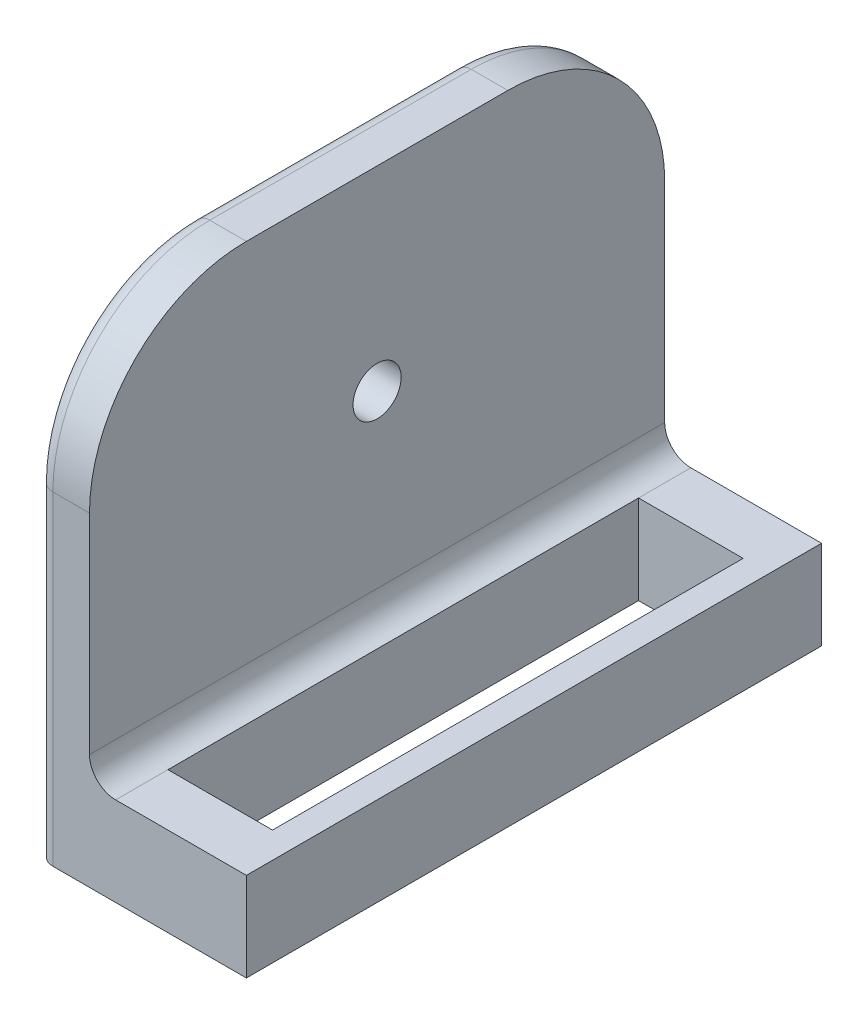
ISO-10303-21;
HEADER;
FILE_DESCRIPTION(('STEP AP214'),'2;1');
FILE_NAME('part.step','',(''),(''),'','','');
FILE_SCHEMA(('AUTOMOTIVE_DESIGN { 1 0 10303 214 1 1 1 1 }'));
ENDSEC;
DATA;
#1=APPLICATION_CONTEXT('core data for automotive mechanical design processes');
#2=APPLICATION_PROTOCOL_DEFINITION('international standard','automotive_design',2000,#1);
#3=PRODUCT_CONTEXT('',#1,'mechanical');
#4=PRODUCT('Part','Part','',(#3));
#5=PRODUCT_RELATED_PRODUCT_CATEGORY('part','',(#4));
#6=PRODUCT_DEFINITION_FORMATION('','',#4);
#7=PRODUCT_DEFINITION_CONTEXT('part definition',#1,'design');
#8=PRODUCT_DEFINITION('design','',#6,#7);
#9=PRODUCT_DEFINITION_SHAPE('','',#8);
#10=(LENGTH_UNIT() NAMED_UNIT(*) SI_UNIT(.MILLI.,.METRE.));
#11=(NAMED_UNIT(*) PLANE_ANGLE_UNIT() SI_UNIT($,.RADIAN.));
#12=(NAMED_UNIT(*) SI_UNIT($,.STERADIAN.) SOLID_ANGLE_UNIT());
#13=UNCERTAINTY_MEASURE_WITH_UNIT(LENGTH_MEASURE(1.E-05),#10,'distance_accuracy_value','');
#14=(GEOMETRIC_REPRESENTATION_CONTEXT(3) GLOBAL_UNCERTAINTY_ASSIGNED_CONTEXT((#13)) GLOBAL_UNIT_ASSIGNED_CONTEXT((#10,
#11,#12)) REPRESENTATION_CONTEXT('',''));
#15=CARTESIAN_POINT('',(0.,0.,0.));
#16=DIRECTION('',(0.,0.,1.));
#17=DIRECTION('',(1.,0.,0.));
#18=AXIS2_PLACEMENT_3D('',#15,#16,#17);
#19=CARTESIAN_POINT('',(0.,17.,0.));
#20=DIRECTION('',(0.,-1.,0.));
#21=DIRECTION('',(0.,0.,-1.));
#22=AXIS2_PLACEMENT_3D('',#19,#20,#21);
#23=PLANE('',#22);
#24=DIRECTION('',(-1.,0.,0.));
#25=VECTOR('',#24,1.);
#26=CARTESIAN_POINT('',(0.,17.,-110.));
#27=LINE('',#26,#25);
#28=CARTESIAN_POINT('',(40.,17.,-110.));
#29=VERTEX_POINT('',#28);
#30=CARTESIAN_POINT('',(15.,17.,-110.));
#31=VERTEX_POINT('',#30);
#32=EDGE_CURVE('E227',#29,#31,#27,.T.);
#33=ORIENTED_EDGE('',*,*,#32,.T.);
#34=DIRECTION('',(0.,0.,-1.));
#35=VECTOR('',#34,1.);
#36=CARTESIAN_POINT('',(15.,17.,0.));
#37=LINE('',#36,#35);
#38=CARTESIAN_POINT('',(15.,17.,-100.));
#39=VERTEX_POINT('',#38);
#40=EDGE_CURVE('E330',#31,#39,#37,.F.);
#41=ORIENTED_EDGE('',*,*,#40,.T.);
#42=DIRECTION('',(-1.,0.,0.));
#43=VECTOR('',#42,1.);
#44=CARTESIAN_POINT('',(15.,17.,-100.));
#45=LINE('',#44,#43);
#46=CARTESIAN_POINT('',(35.,17.,-100.));
#47=VERTEX_POINT('',#46);
#48=EDGE_CURVE('E184',#47,#39,#45,.T.);
#49=ORIENTED_EDGE('',*,*,#48,.F.);
#50=DIRECTION('',(0.,0.,-1.));
#51=VECTOR('',#50,1.);
#52=CARTESIAN_POINT('',(35.,17.,-100.));
#53=LINE('',#52,#51);
#54=CARTESIAN_POINT('',(35.,17.,-10.));
#55=VERTEX_POINT('',#54);
#56=EDGE_CURVE('E188',#55,#47,#53,.T.);
#57=ORIENTED_EDGE('',*,*,#56,.F.);
#58=DIRECTION('',(1.,0.,0.));
#59=VECTOR('',#58,1.);
#60=CARTESIAN_POINT('',(15.,17.,-10.));
#61=LINE('',#60,#59);
#62=CARTESIAN_POINT('',(15.,17.,-10.));
#63=VERTEX_POINT('',#62);
#64=EDGE_CURVE('E176',#63,#55,#61,.T.);
#65=ORIENTED_EDGE('',*,*,#64,.F.);
#66=DIRECTION('',(0.,0.,-1.));
#67=VECTOR('',#66,1.);
#68=CARTESIAN_POINT('',(15.,17.,0.));
#69=LINE('',#68,#67);
#70=CARTESIAN_POINT('',(15.,17.,0.));
#71=VERTEX_POINT('',#70);
#72=EDGE_CURVE('E68',#63,#71,#69,.F.);
#73=ORIENTED_EDGE('',*,*,#72,.T.);
#74=DIRECTION('',(1.,0.,0.));
#75=VECTOR('',#74,1.);
#76=CARTESIAN_POINT('',(0.,17.,0.));
#77=LINE('',#76,#75);
#78=CARTESIAN_POINT('',(40.,17.,0.));
#79=VERTEX_POINT('',#78);
#80=EDGE_CURVE('E220',#71,#79,#77,.T.);
#81=ORIENTED_EDGE('',*,*,#80,.T.);
#82=DIRECTION('',(0.,0.,-1.));
#83=VECTOR('',#82,1.);
#84=CARTESIAN_POINT('',(40.,17.,0.));
#85=LINE('',#84,#83);
#86=EDGE_CURVE('E223',#79,#29,#85,.T.);
#87=ORIENTED_EDGE('',*,*,#86,.T.);
#88=EDGE_LOOP('',(#33,#41,#49,#57,#65,#73,#81,#87));
#89=FACE_BOUND('',#88,.T.);
#90=ADVANCED_FACE('F45',(#89),#23,.F.);
#91=CARTESIAN_POINT('',(0.,17.,0.));
#92=DIRECTION('',(1.,0.,0.));
#93=DIRECTION('',(0.,0.,-1.));
#94=AXIS2_PLACEMENT_3D('',#91,#92,#93);
#95=PLANE('',#94);
#96=CARTESIAN_POINT('',(0.,54.7,-55.));
#97=DIRECTION('',(1.,0.,0.));
#98=DIRECTION('',(0.,0.,-1.));
#99=AXIS2_PLACEMENT_3D('',#96,#97,#98);
#100=CIRCLE('',#99,4.6);
#101=CARTESIAN_POINT('',(0.,54.7,-59.6));
#102=VERTEX_POINT('',#101);
#103=EDGE_CURVE('E345',#102,#102,#100,.F.);
#104=ORIENTED_EDGE('',*,*,#103,.F.);
#105=EDGE_LOOP('',(#104));
#106=FACE_BOUND('',#105,.T.);
#107=DIRECTION('',(0.,0.,1.));
#108=VECTOR('',#107,1.);
#109=CARTESIAN_POINT('',(0.,0.,0.));
#110=LINE('',#109,#108);
#111=CARTESIAN_POINT('',(0.,0.,-107.));
#112=VERTEX_POINT('',#111);
#113=CARTESIAN_POINT('',(0.,0.,-3.));
#114=VERTEX_POINT('',#113);
#115=EDGE_CURVE('E219',#112,#114,#110,.T.);
#116=ORIENTED_EDGE('',*,*,#115,.T.);
#117=DIRECTION('',(0.,-1.,0.));
#118=VECTOR('',#117,1.);
#119=CARTESIAN_POINT('',(0.,17.,-3.));
#120=LINE('',#119,#118);
#121=CARTESIAN_POINT('',(0.,62.,-3.));
#122=VERTEX_POINT('',#121);
#123=EDGE_CURVE('E284',#114,#122,#120,.F.);
#124=ORIENTED_EDGE('',*,*,#123,.T.);
#125=CARTESIAN_POINT('',(0.,62.,-30.));
#126=DIRECTION('',(1.,0.,0.));
#127=DIRECTION('',(0.,0.,-1.));
#128=AXIS2_PLACEMENT_3D('',#125,#126,#127);
#129=CIRCLE('',#128,27.);
#130=CARTESIAN_POINT('',(0.,89.,-30.));
#131=VERTEX_POINT('',#130);
#132=EDGE_CURVE('E280',#122,#131,#129,.F.);
#133=ORIENTED_EDGE('',*,*,#132,.T.);
#134=DIRECTION('',(0.,0.,1.));
#135=VECTOR('',#134,1.);
#136=CARTESIAN_POINT('',(0.,89.,0.));
#137=LINE('',#136,#135);
#138=CARTESIAN_POINT('',(0.,89.,-80.));
#139=VERTEX_POINT('',#138);
#140=EDGE_CURVE('E277',#131,#139,#137,.F.);
#141=ORIENTED_EDGE('',*,*,#140,.T.);
#142=CARTESIAN_POINT('',(0.,62.,-80.));
#143=DIRECTION('',(1.,0.,0.));
#144=DIRECTION('',(0.,0.,-1.));
#145=AXIS2_PLACEMENT_3D('',#142,#143,#144);
#146=CIRCLE('',#145,27.);
#147=CARTESIAN_POINT('',(0.,62.,-107.));
#148=VERTEX_POINT('',#147);
#149=EDGE_CURVE('E274',#139,#148,#146,.F.);
#150=ORIENTED_EDGE('',*,*,#149,.T.);
#151=DIRECTION('',(0.,-1.,0.));
#152=VECTOR('',#151,1.);
#153=CARTESIAN_POINT('',(0.,17.,-107.));
#154=LINE('',#153,#152);
#155=EDGE_CURVE('E271',#148,#112,#154,.T.);
#156=ORIENTED_EDGE('',*,*,#155,.T.);
#157=EDGE_LOOP('',(#116,#124,#133,#141,#150,#156));
#158=FACE_BOUND('',#157,.T.);
#159=ADVANCED_FACE('F391',(#106,#158),#95,.F.);
#160=CARTESIAN_POINT('',(0.,17.,0.));
#161=DIRECTION('',(0.,0.,-1.));
#162=DIRECTION('',(-1.,0.,0.));
#163=AXIS2_PLACEMENT_3D('',#160,#161,#162);
#164=PLANE('',#163);
#165=DIRECTION('',(-1.,0.,0.));
#166=VECTOR('',#165,1.);
#167=CARTESIAN_POINT('',(0.,62.,0.));
#168=LINE('',#167,#166);
#169=CARTESIAN_POINT('',(10.,62.,0.));
#170=VERTEX_POINT('',#169);
#171=CARTESIAN_POINT('',(3.,62.,0.));
#172=VERTEX_POINT('',#171);
#173=EDGE_CURVE('E250',#170,#172,#168,.T.);
#174=ORIENTED_EDGE('',*,*,#173,.T.);
#175=DIRECTION('',(0.,-1.,0.));
#176=VECTOR('',#175,1.);
#177=CARTESIAN_POINT('',(3.,17.,0.));
#178=LINE('',#177,#176);
#179=CARTESIAN_POINT('',(3.,0.,0.));
#180=VERTEX_POINT('',#179);
#181=EDGE_CURVE('E296',#172,#180,#178,.T.);
#182=ORIENTED_EDGE('',*,*,#181,.T.);
#183=DIRECTION('',(1.,0.,0.));
#184=VECTOR('',#183,1.);
#185=CARTESIAN_POINT('',(0.,0.,0.));
#186=LINE('',#185,#184);
#187=CARTESIAN_POINT('',(40.,0.,0.));
#188=VERTEX_POINT('',#187);
#189=EDGE_CURVE('E234',#180,#188,#186,.T.);
#190=ORIENTED_EDGE('',*,*,#189,.T.);
#191=DIRECTION('',(0.,-1.,0.));
#192=VECTOR('',#191,1.);
#193=CARTESIAN_POINT('',(40.,17.,0.));
#194=LINE('',#193,#192);
#195=EDGE_CURVE('E246',#79,#188,#194,.T.);
#196=ORIENTED_EDGE('',*,*,#195,.F.);
#197=ORIENTED_EDGE('',*,*,#80,.F.);
#198=CARTESIAN_POINT('',(15.,22.,0.));
#199=DIRECTION('',(0.,0.,-1.));
#200=DIRECTION('',(-1.,0.,0.));
#201=AXIS2_PLACEMENT_3D('',#198,#199,#200);
#202=CIRCLE('',#201,5.);
#203=CARTESIAN_POINT('',(10.,22.,0.));
#204=VERTEX_POINT('',#203);
#205=EDGE_CURVE('E11',#71,#204,#202,.T.);
#206=ORIENTED_EDGE('',*,*,#205,.T.);
#207=DIRECTION('',(0.,-1.,0.));
#208=VECTOR('',#207,1.);
#209=CARTESIAN_POINT('',(10.,17.,0.));
#210=LINE('',#209,#208);
#211=EDGE_CURVE('E208',#170,#204,#210,.T.);
#212=ORIENTED_EDGE('',*,*,#211,.F.);
#213=EDGE_LOOP('',(#174,#182,#190,#196,#197,#206,#212));
#214=FACE_BOUND('',#213,.T.);
#215=ADVANCED_FACE('F371',(#214),#164,.F.);
#216=CARTESIAN_POINT('',(40.,17.,0.));
#217=DIRECTION('',(-1.,0.,0.));
#218=DIRECTION('',(0.,0.,1.));
#219=AXIS2_PLACEMENT_3D('',#216,#217,#218);
#220=PLANE('',#219);
#221=DIRECTION('',(0.,0.,-1.));
#222=VECTOR('',#221,1.);
#223=CARTESIAN_POINT('',(40.,0.,0.));
#224=LINE('',#223,#222);
#225=CARTESIAN_POINT('',(40.,0.,-110.));
#226=VERTEX_POINT('',#225);
#227=EDGE_CURVE('E237',#188,#226,#224,.T.);
#228=ORIENTED_EDGE('',*,*,#227,.T.);
#229=DIRECTION('',(0.,-1.,0.));
#230=VECTOR('',#229,1.);
#231=CARTESIAN_POINT('',(40.,17.,-110.));
#232=LINE('',#231,#230);
#233=EDGE_CURVE('E230',#29,#226,#232,.T.);
#234=ORIENTED_EDGE('',*,*,#233,.F.);
#235=ORIENTED_EDGE('',*,*,#86,.F.);
#236=ORIENTED_EDGE('',*,*,#195,.T.);
#237=EDGE_LOOP('',(#228,#234,#235,#236));
#238=FACE_BOUND('',#237,.T.);
#239=ADVANCED_FACE('F376',(#238),#220,.F.);
#240=CARTESIAN_POINT('',(0.,17.,-110.));
#241=DIRECTION('',(0.,0.,1.));
#242=DIRECTION('',(1.,0.,0.));
#243=AXIS2_PLACEMENT_3D('',#240,#241,#242);
#244=PLANE('',#243);
#245=DIRECTION('',(-1.,0.,0.));
#246=VECTOR('',#245,1.);
#247=CARTESIAN_POINT('',(0.,0.,-110.));
#248=LINE('',#247,#246);
#249=CARTESIAN_POINT('',(3.,0.,-110.));
#250=VERTEX_POINT('',#249);
#251=EDGE_CURVE('E224',#226,#250,#248,.T.);
#252=ORIENTED_EDGE('',*,*,#251,.T.);
#253=DIRECTION('',(0.,-1.,0.));
#254=VECTOR('',#253,1.);
#255=CARTESIAN_POINT('',(3.,17.,-110.));
#256=LINE('',#255,#254);
#257=CARTESIAN_POINT('',(3.,62.,-110.));
#258=VERTEX_POINT('',#257);
#259=EDGE_CURVE('E305',#250,#258,#256,.F.);
#260=ORIENTED_EDGE('',*,*,#259,.T.);
#261=DIRECTION('',(-1.,0.,0.));
#262=VECTOR('',#261,1.);
#263=CARTESIAN_POINT('',(0.,62.,-110.));
#264=LINE('',#263,#262);
#265=CARTESIAN_POINT('',(10.,62.,-110.));
#266=VERTEX_POINT('',#265);
#267=EDGE_CURVE('E267',#258,#266,#264,.F.);
#268=ORIENTED_EDGE('',*,*,#267,.T.);
#269=DIRECTION('',(0.,1.,0.));
#270=VECTOR('',#269,1.);
#271=CARTESIAN_POINT('',(10.,17.,-110.));
#272=LINE('',#271,#270);
#273=CARTESIAN_POINT('',(10.,22.,-110.));
#274=VERTEX_POINT('',#273);
#275=EDGE_CURVE('E212',#274,#266,#272,.T.);
#276=ORIENTED_EDGE('',*,*,#275,.F.);
#277=CARTESIAN_POINT('',(15.,22.,-110.));
#278=DIRECTION('',(0.,0.,1.));
#279=DIRECTION('',(1.,0.,0.));
#280=AXIS2_PLACEMENT_3D('',#277,#278,#279);
#281=CIRCLE('',#280,5.);
#282=EDGE_CURVE('E54',#274,#31,#281,.T.);
#283=ORIENTED_EDGE('',*,*,#282,.T.);
#284=ORIENTED_EDGE('',*,*,#32,.F.);
#285=ORIENTED_EDGE('',*,*,#233,.T.);
#286=EDGE_LOOP('',(#252,#260,#268,#276,#283,#284,#285));
#287=FACE_BOUND('',#286,.T.);
#288=ADVANCED_FACE('F379',(#287),#244,.F.);
#289=CARTESIAN_POINT('',(0.,0.,0.));
#290=DIRECTION('',(0.,-1.,0.));
#291=DIRECTION('',(0.,0.,-1.));
#292=AXIS2_PLACEMENT_3D('',#289,#290,#291);
#293=PLANE('',#292);
#294=DIRECTION('',(1.,0.,0.));
#295=VECTOR('',#294,1.);
#296=CARTESIAN_POINT('',(15.,0.,-10.));
#297=LINE('',#296,#295);
#298=CARTESIAN_POINT('',(15.,0.,-10.));
#299=VERTEX_POINT('',#298);
#300=CARTESIAN_POINT('',(35.,0.,-10.));
#301=VERTEX_POINT('',#300);
#302=EDGE_CURVE('E174',#299,#301,#297,.T.);
#303=ORIENTED_EDGE('',*,*,#302,.T.);
#304=DIRECTION('',(0.,0.,-1.));
#305=VECTOR('',#304,1.);
#306=CARTESIAN_POINT('',(35.,0.,-100.));
#307=LINE('',#306,#305);
#308=CARTESIAN_POINT('',(35.,0.,-100.));
#309=VERTEX_POINT('',#308);
#310=EDGE_CURVE('E159',#301,#309,#307,.T.);
#311=ORIENTED_EDGE('',*,*,#310,.T.);
#312=DIRECTION('',(-1.,0.,0.));
#313=VECTOR('',#312,1.);
#314=CARTESIAN_POINT('',(15.,0.,-100.));
#315=LINE('',#314,#313);
#316=CARTESIAN_POINT('',(15.,0.,-100.));
#317=VERTEX_POINT('',#316);
#318=EDGE_CURVE('E198',#309,#317,#315,.T.);
#319=ORIENTED_EDGE('',*,*,#318,.T.);
#320=DIRECTION('',(0.,0.,1.));
#321=VECTOR('',#320,1.);
#322=CARTESIAN_POINT('',(15.,0.,-100.));
#323=LINE('',#322,#321);
#324=EDGE_CURVE('E182',#317,#299,#323,.T.);
#325=ORIENTED_EDGE('',*,*,#324,.T.);
#326=EDGE_LOOP('',(#303,#311,#319,#325));
#327=FACE_BOUND('',#326,.T.);
#328=ORIENTED_EDGE('',*,*,#189,.F.);
#329=CARTESIAN_POINT('',(3.,0.,-3.));
#330=DIRECTION('',(0.,-1.,0.));
#331=DIRECTION('',(0.,0.,-1.));
#332=AXIS2_PLACEMENT_3D('',#329,#330,#331);
#333=CIRCLE('',#332,3.);
#334=EDGE_CURVE('E302',#180,#114,#333,.T.);
#335=ORIENTED_EDGE('',*,*,#334,.T.);
#336=ORIENTED_EDGE('',*,*,#115,.F.);
#337=CARTESIAN_POINT('',(3.,0.,-107.));
#338=DIRECTION('',(0.,-1.,0.));
#339=DIRECTION('',(0.,0.,-1.));
#340=AXIS2_PLACEMENT_3D('',#337,#338,#339);
#341=CIRCLE('',#340,3.);
#342=EDGE_CURVE('E299',#112,#250,#341,.T.);
#343=ORIENTED_EDGE('',*,*,#342,.T.);
#344=ORIENTED_EDGE('',*,*,#251,.F.);
#345=ORIENTED_EDGE('',*,*,#227,.F.);
#346=EDGE_LOOP('',(#328,#335,#336,#343,#344,#345));
#347=FACE_BOUND('',#346,.T.);
#348=ADVANCED_FACE('F180',(#327,#347),#293,.T.);
#349=CARTESIAN_POINT('',(10.,92.,0.));
#350=DIRECTION('',(0.,-1.,0.));
#351=DIRECTION('',(0.,0.,-1.));
#352=AXIS2_PLACEMENT_3D('',#349,#350,#351);
#353=PLANE('',#352);
#354=DIRECTION('',(-1.,0.,0.));
#355=VECTOR('',#354,1.);
#356=CARTESIAN_POINT('',(10.,92.,-80.));
#357=LINE('',#356,#355);
#358=CARTESIAN_POINT('',(10.,92.,-80.));
#359=VERTEX_POINT('',#358);
#360=CARTESIAN_POINT('',(3.,92.,-80.));
#361=VERTEX_POINT('',#360);
#362=EDGE_CURVE('E254',#359,#361,#357,.T.);
#363=ORIENTED_EDGE('',*,*,#362,.T.);
#364=DIRECTION('',(0.,0.,1.));
#365=VECTOR('',#364,1.);
#366=CARTESIAN_POINT('',(3.,92.,0.));
#367=LINE('',#366,#365);
#368=CARTESIAN_POINT('',(3.,92.,-30.));
#369=VERTEX_POINT('',#368);
#370=EDGE_CURVE('E290',#361,#369,#367,.T.);
#371=ORIENTED_EDGE('',*,*,#370,.T.);
#372=DIRECTION('',(-1.,0.,0.));
#373=VECTOR('',#372,1.);
#374=CARTESIAN_POINT('',(10.,92.,-30.));
#375=LINE('',#374,#373);
#376=CARTESIAN_POINT('',(10.,92.,-30.));
#377=VERTEX_POINT('',#376);
#378=EDGE_CURVE('E258',#369,#377,#375,.F.);
#379=ORIENTED_EDGE('',*,*,#378,.T.);
#380=DIRECTION('',(0.,0.,1.));
#381=VECTOR('',#380,1.);
#382=CARTESIAN_POINT('',(10.,92.,0.));
#383=LINE('',#382,#381);
#384=EDGE_CURVE('E215',#359,#377,#383,.T.);
#385=ORIENTED_EDGE('',*,*,#384,.F.);
#386=EDGE_LOOP('',(#363,#371,#379,#385));
#387=FACE_BOUND('',#386,.T.);
#388=ADVANCED_FACE('F364',(#387),#353,.F.);
#389=CARTESIAN_POINT('',(10.,0.,0.));
#390=DIRECTION('',(-1.,0.,0.));
#391=DIRECTION('',(0.,0.,1.));
#392=AXIS2_PLACEMENT_3D('',#389,#390,#391);
#393=PLANE('',#392);
#394=CARTESIAN_POINT('',(10.,54.7,-55.));
#395=DIRECTION('',(1.,0.,0.));
#396=DIRECTION('',(0.,0.,-1.));
#397=AXIS2_PLACEMENT_3D('',#394,#395,#396);
#398=CIRCLE('',#397,4.6);
#399=CARTESIAN_POINT('',(10.,54.7,-59.6));
#400=VERTEX_POINT('',#399);
#401=EDGE_CURVE('E324',#400,#400,#398,.T.);
#402=ORIENTED_EDGE('',*,*,#401,.F.);
#403=EDGE_LOOP('',(#402));
#404=FACE_BOUND('',#403,.T.);
#405=ORIENTED_EDGE('',*,*,#211,.T.);
#406=DIRECTION('',(0.,0.,-1.));
#407=VECTOR('',#406,1.);
#408=CARTESIAN_POINT('',(10.,22.,-110.));
#409=LINE('',#408,#407);
#410=EDGE_CURVE('E308',#204,#274,#409,.T.);
#411=ORIENTED_EDGE('',*,*,#410,.T.);
#412=ORIENTED_EDGE('',*,*,#275,.T.);
#413=CARTESIAN_POINT('',(10.,62.,-80.));
#414=DIRECTION('',(-1.,0.,0.));
#415=DIRECTION('',(0.,0.,1.));
#416=AXIS2_PLACEMENT_3D('',#413,#414,#415);
#417=CIRCLE('',#416,30.);
#418=EDGE_CURVE('E261',#266,#359,#417,.F.);
#419=ORIENTED_EDGE('',*,*,#418,.T.);
#420=ORIENTED_EDGE('',*,*,#384,.T.);
#421=CARTESIAN_POINT('',(10.,62.,-30.));
#422=DIRECTION('',(-1.,0.,0.));
#423=DIRECTION('',(0.,0.,1.));
#424=AXIS2_PLACEMENT_3D('',#421,#422,#423);
#425=CIRCLE('',#424,30.);
#426=EDGE_CURVE('E264',#377,#170,#425,.F.);
#427=ORIENTED_EDGE('',*,*,#426,.T.);
#428=EDGE_LOOP('',(#405,#411,#412,#419,#420,#427));
#429=FACE_BOUND('',#428,.T.);
#430=ADVANCED_FACE('F361',(#404,#429),#393,.F.);
#431=CARTESIAN_POINT('',(15.,-92.1954445729289,-10.));
#432=DIRECTION('',(0.,0.,1.));
#433=DIRECTION('',(1.,0.,0.));
#434=AXIS2_PLACEMENT_3D('',#431,#432,#433);
#435=PLANE('',#434);
#436=DIRECTION('',(0.,1.,0.));
#437=VECTOR('',#436,1.);
#438=CARTESIAN_POINT('',(15.,-92.1954445729289,-10.));
#439=LINE('',#438,#437);
#440=EDGE_CURVE('E196',#299,#63,#439,.T.);
#441=ORIENTED_EDGE('',*,*,#440,.T.);
#442=ORIENTED_EDGE('',*,*,#64,.T.);
#443=DIRECTION('',(0.,1.,0.));
#444=VECTOR('',#443,1.);
#445=CARTESIAN_POINT('',(35.,-92.1954445729289,-10.));
#446=LINE('',#445,#444);
#447=EDGE_CURVE('E163',#301,#55,#446,.T.);
#448=ORIENTED_EDGE('',*,*,#447,.F.);
#449=ORIENTED_EDGE('',*,*,#302,.F.);
#450=EDGE_LOOP('',(#441,#442,#448,#449));
#451=FACE_BOUND('',#450,.T.);
#452=ADVANCED_FACE('F173',(#451),#435,.F.);
#453=CARTESIAN_POINT('',(35.,-92.1954445729289,-100.));
#454=DIRECTION('',(1.,0.,0.));
#455=DIRECTION('',(0.,0.,-1.));
#456=AXIS2_PLACEMENT_3D('',#453,#454,#455);
#457=PLANE('',#456);
#458=ORIENTED_EDGE('',*,*,#447,.T.);
#459=ORIENTED_EDGE('',*,*,#56,.T.);
#460=DIRECTION('',(0.,1.,0.));
#461=VECTOR('',#460,1.);
#462=CARTESIAN_POINT('',(35.,-92.1954445729289,-100.));
#463=LINE('',#462,#461);
#464=EDGE_CURVE('E165',#309,#47,#463,.T.);
#465=ORIENTED_EDGE('',*,*,#464,.F.);
#466=ORIENTED_EDGE('',*,*,#310,.F.);
#467=EDGE_LOOP('',(#458,#459,#465,#466));
#468=FACE_BOUND('',#467,.T.);
#469=ADVANCED_FACE('F161',(#468),#457,.F.);
#470=CARTESIAN_POINT('',(15.,-92.1954445729289,-100.));
#471=DIRECTION('',(0.,0.,-1.));
#472=DIRECTION('',(-1.,0.,0.));
#473=AXIS2_PLACEMENT_3D('',#470,#471,#472);
#474=PLANE('',#473);
#475=ORIENTED_EDGE('',*,*,#464,.T.);
#476=ORIENTED_EDGE('',*,*,#48,.T.);
#477=DIRECTION('',(0.,1.,0.));
#478=VECTOR('',#477,1.);
#479=CARTESIAN_POINT('',(15.,-92.1954445729289,-100.));
#480=LINE('',#479,#478);
#481=EDGE_CURVE('E197',#317,#39,#480,.T.);
#482=ORIENTED_EDGE('',*,*,#481,.F.);
#483=ORIENTED_EDGE('',*,*,#318,.F.);
#484=EDGE_LOOP('',(#475,#476,#482,#483));
#485=FACE_BOUND('',#484,.T.);
#486=ADVANCED_FACE('F339',(#485),#474,.F.);
#487=CARTESIAN_POINT('',(15.,-92.1954445729289,-100.));
#488=DIRECTION('',(-1.,0.,0.));
#489=DIRECTION('',(0.,0.,1.));
#490=AXIS2_PLACEMENT_3D('',#487,#488,#489);
#491=PLANE('',#490);
#492=ORIENTED_EDGE('',*,*,#481,.T.);
#493=DIRECTION('',(0.,0.,1.));
#494=VECTOR('',#493,1.);
#495=CARTESIAN_POINT('',(15.,17.,-100.));
#496=LINE('',#495,#494);
#497=EDGE_CURVE('E192',#39,#63,#496,.T.);
#498=ORIENTED_EDGE('',*,*,#497,.T.);
#499=ORIENTED_EDGE('',*,*,#440,.F.);
#500=ORIENTED_EDGE('',*,*,#324,.F.);
#501=EDGE_LOOP('',(#492,#498,#499,#500));
#502=FACE_BOUND('',#501,.T.);
#503=ADVANCED_FACE('F342',(#502),#491,.F.);
#504=CARTESIAN_POINT('',(-13.0107647738325,54.7,-55.));
#505=DIRECTION('',(1.,0.,0.));
#506=DIRECTION('',(0.,0.,-1.));
#507=AXIS2_PLACEMENT_3D('',#504,#505,#506);
#508=CYLINDRICAL_SURFACE('',#507,4.6);
#509=CARTESIAN_POINT('',(0.,54.7,-59.6));
#510=CARTESIAN_POINT('',(0.104166666666667,54.7,-59.6));
#511=CARTESIAN_POINT('',(0.208333333333334,54.7,-59.6));
#512=CARTESIAN_POINT('',(0.416666666666667,54.7,-59.6));
#513=CARTESIAN_POINT('',(0.520833333333334,54.7,-59.6));
#514=CARTESIAN_POINT('',(0.729166666666667,54.7,-59.6));
#515=CARTESIAN_POINT('',(0.833333333333333,54.7,-59.6));
#516=CARTESIAN_POINT('',(1.04166666666667,54.7,-59.6));
#517=CARTESIAN_POINT('',(1.14583333333333,54.7,-59.6));
#518=CARTESIAN_POINT('',(1.35416666666667,54.7,-59.6));
#519=CARTESIAN_POINT('',(1.45833333333333,54.7,-59.6));
#520=CARTESIAN_POINT('',(1.66666666666667,54.7,-59.6));
#521=CARTESIAN_POINT('',(1.77083333333333,54.7,-59.6));
#522=CARTESIAN_POINT('',(1.97916666666667,54.7,-59.6));
#523=CARTESIAN_POINT('',(2.08333333333333,54.7,-59.6));
#524=CARTESIAN_POINT('',(2.29166666666667,54.7,-59.6));
#525=CARTESIAN_POINT('',(2.39583333333333,54.7,-59.6));
#526=CARTESIAN_POINT('',(2.60416666666666,54.7,-59.6));
#527=CARTESIAN_POINT('',(2.70833333333333,54.7,-59.6));
#528=CARTESIAN_POINT('',(2.91666666666666,54.7,-59.6));
#529=CARTESIAN_POINT('',(3.02083333333333,54.7,-59.6));
#530=CARTESIAN_POINT('',(3.22916666666666,54.7,-59.6));
#531=CARTESIAN_POINT('',(3.33333333333333,54.7,-59.6));
#532=CARTESIAN_POINT('',(3.54166666666666,54.7,-59.6));
#533=CARTESIAN_POINT('',(3.64583333333333,54.7,-59.6));
#534=CARTESIAN_POINT('',(3.85416666666667,54.7,-59.6));
#535=CARTESIAN_POINT('',(3.95833333333333,54.7,-59.6));
#536=CARTESIAN_POINT('',(4.16666666666667,54.7,-59.6));
#537=CARTESIAN_POINT('',(4.27083333333333,54.7,-59.6));
#538=CARTESIAN_POINT('',(4.47916666666667,54.7,-59.6));
#539=CARTESIAN_POINT('',(4.58333333333333,54.7,-59.6));
#540=CARTESIAN_POINT('',(4.79166666666667,54.7,-59.6));
#541=CARTESIAN_POINT('',(4.89583333333333,54.7,-59.6));
#542=CARTESIAN_POINT('',(5.10416666666667,54.7,-59.6));
#543=CARTESIAN_POINT('',(5.20833333333333,54.7,-59.6));
#544=CARTESIAN_POINT('',(5.41666666666667,54.7,-59.6));
#545=CARTESIAN_POINT('',(5.52083333333333,54.7,-59.6));
#546=CARTESIAN_POINT('',(5.72916666666666,54.7,-59.6));
#547=CARTESIAN_POINT('',(5.83333333333333,54.7,-59.6));
#548=CARTESIAN_POINT('',(6.04166666666666,54.7,-59.6));
#549=CARTESIAN_POINT('',(6.14583333333333,54.7,-59.6));
#550=CARTESIAN_POINT('',(6.35416666666666,54.7,-59.6));
#551=CARTESIAN_POINT('',(6.45833333333333,54.7,-59.6));
#552=CARTESIAN_POINT('',(6.66666666666666,54.7,-59.6));
#553=CARTESIAN_POINT('',(6.77083333333333,54.7,-59.6));
#554=CARTESIAN_POINT('',(6.97916666666666,54.7,-59.6));
#555=CARTESIAN_POINT('',(7.08333333333333,54.7,-59.6));
#556=CARTESIAN_POINT('',(7.29166666666666,54.7,-59.6));
#557=CARTESIAN_POINT('',(7.39583333333333,54.7,-59.6));
#558=CARTESIAN_POINT('',(7.60416666666666,54.7,-59.6));
#559=CARTESIAN_POINT('',(7.70833333333333,54.7,-59.6));
#560=CARTESIAN_POINT('',(7.91666666666666,54.7,-59.6));
#561=CARTESIAN_POINT('',(8.02083333333333,54.7,-59.6));
#562=CARTESIAN_POINT('',(8.22916666666666,54.7,-59.6));
#563=CARTESIAN_POINT('',(8.33333333333333,54.7,-59.6));
#564=CARTESIAN_POINT('',(8.54166666666666,54.7,-59.6));
#565=CARTESIAN_POINT('',(8.64583333333333,54.7,-59.6));
#566=CARTESIAN_POINT('',(8.85416666666666,54.7,-59.6));
#567=CARTESIAN_POINT('',(8.95833333333333,54.7,-59.6));
#568=CARTESIAN_POINT('',(9.16666666666666,54.7,-59.6));
#569=CARTESIAN_POINT('',(9.27083333333333,54.7,-59.6));
#570=CARTESIAN_POINT('',(9.47916666666666,54.7,-59.6));
#571=CARTESIAN_POINT('',(9.58333333333333,54.7,-59.6));
#572=CARTESIAN_POINT('',(9.79166666666666,54.7,-59.6));
#573=CARTESIAN_POINT('',(9.89583333333333,54.7,-59.6));
#574=CARTESIAN_POINT('',(10.,54.7,-59.6));
#575=B_SPLINE_CURVE_WITH_KNOTS('',3,(#509,#510,#511,#512,#513,#514,#515,#516,#517,#518,#519,
#520,#521,#522,#523,#524,#525,#526,#527,#528,#529,#530,#531,#532,#533,#534,#535,#536,#537,#538,
#539,#540,#541,#542,#543,#544,#545,#546,#547,#548,#549,#550,#551,#552,#553,#554,#555,#556,#557,
#558,#559,#560,#561,#562,#563,#564,#565,#566,#567,#568,#569,#570,#571,#572,#573,#574),
.UNSPECIFIED.,.F.,.F.,(4,2,2,2,2,2,2,2,2,2,2,2,2,2,2,2,2,2,2,2,2,2,2,2,2,2,2,2,2,2,2,2,4),(0.,
0.3125,0.625000000000001,0.937499999999999,1.25,1.5625,1.875,2.1875,2.5,2.8125,3.125,3.4375,
3.75,4.0625,4.375,4.6875,5.,5.3125,5.625,5.9375,6.25,6.5625,6.875,7.1875,7.5,7.8125,
8.12499999999999,8.43749999999999,8.75,9.0625,9.375,9.6875,10.),.UNSPECIFIED.);
#576=EDGE_CURVE('BSEAM359',#102,#400,#575,.T.);
#577=ORIENTED_EDGE('',*,*,#103,.T.);
#578=ORIENTED_EDGE('',*,*,#401,.T.);
#579=ORIENTED_EDGE('',*,*,#576,.T.);
#580=ORIENTED_EDGE('',*,*,#576,.F.);
#581=EDGE_LOOP('',(#577,#579,#578,#580));
#582=FACE_BOUND('',#581,.T.);
#583=ADVANCED_FACE('F359',(#582),#508,.F.);
#584=CARTESIAN_POINT('',(0.,62.,-30.));
#585=DIRECTION('',(-1.,0.,0.));
#586=DIRECTION('',(0.,0.,1.));
#587=AXIS2_PLACEMENT_3D('',#584,#585,#586);
#588=CYLINDRICAL_SURFACE('',#587,30.);
#589=ORIENTED_EDGE('',*,*,#378,.F.);
#590=CARTESIAN_POINT('',(3.,62.,-30.));
#591=DIRECTION('',(1.,0.,0.));
#592=DIRECTION('',(0.,0.,-1.));
#593=AXIS2_PLACEMENT_3D('',#590,#591,#592);
#594=CIRCLE('',#593,30.);
#595=EDGE_CURVE('E287',#369,#172,#594,.T.);
#596=ORIENTED_EDGE('',*,*,#595,.T.);
#597=ORIENTED_EDGE('',*,*,#173,.F.);
#598=ORIENTED_EDGE('',*,*,#426,.F.);
#599=EDGE_LOOP('',(#589,#596,#597,#598));
#600=FACE_BOUND('',#599,.T.);
#601=ADVANCED_FACE('F412',(#600),#588,.T.);
#602=CARTESIAN_POINT('',(10.,62.,-80.));
#603=DIRECTION('',(-1.,0.,0.));
#604=DIRECTION('',(0.,0.,1.));
#605=AXIS2_PLACEMENT_3D('',#602,#603,#604);
#606=CYLINDRICAL_SURFACE('',#605,30.);
#607=ORIENTED_EDGE('',*,*,#267,.F.);
#608=CARTESIAN_POINT('',(3.,62.,-80.));
#609=DIRECTION('',(1.,0.,0.));
#610=DIRECTION('',(0.,0.,-1.));
#611=AXIS2_PLACEMENT_3D('',#608,#609,#610);
#612=CIRCLE('',#611,30.);
#613=EDGE_CURVE('E293',#258,#361,#612,.T.);
#614=ORIENTED_EDGE('',*,*,#613,.T.);
#615=ORIENTED_EDGE('',*,*,#362,.F.);
#616=ORIENTED_EDGE('',*,*,#418,.F.);
#617=EDGE_LOOP('',(#607,#614,#615,#616));
#618=FACE_BOUND('',#617,.T.);
#619=ADVANCED_FACE('F416',(#618),#606,.T.);
#620=CARTESIAN_POINT('',(3.,17.,-107.));
#621=DIRECTION('',(0.,-1.,0.));
#622=DIRECTION('',(0.,0.,-1.));
#623=AXIS2_PLACEMENT_3D('',#620,#621,#622);
#624=CYLINDRICAL_SURFACE('',#623,3.);
#625=ORIENTED_EDGE('',*,*,#342,.F.);
#626=ORIENTED_EDGE('',*,*,#155,.F.);
#627=CARTESIAN_POINT('',(3.,62.,-107.));
#628=DIRECTION('',(0.,1.,0.));
#629=DIRECTION('',(0.,0.,1.));
#630=AXIS2_PLACEMENT_3D('',#627,#628,#629);
#631=CIRCLE('',#630,3.);
#632=EDGE_CURVE('E320',#258,#148,#631,.T.);
#633=ORIENTED_EDGE('',*,*,#632,.F.);
#634=ORIENTED_EDGE('',*,*,#259,.F.);
#635=EDGE_LOOP('',(#625,#626,#633,#634));
#636=FACE_BOUND('',#635,.T.);
#637=ADVANCED_FACE('F422',(#636),#624,.T.);
#638=CARTESIAN_POINT('',(3.,62.,-80.));
#639=DIRECTION('',(1.,0.,0.));
#640=DIRECTION('',(0.,0.,-1.));
#641=AXIS2_PLACEMENT_3D('',#638,#639,#640);
#642=TOROIDAL_SURFACE('',#641,27.,3.);
#643=ORIENTED_EDGE('',*,*,#632,.T.);
#644=ORIENTED_EDGE('',*,*,#149,.F.);
#645=CARTESIAN_POINT('',(3.,89.,-80.));
#646=DIRECTION('',(0.,0.,1.));
#647=DIRECTION('',(1.,0.,0.));
#648=AXIS2_PLACEMENT_3D('',#645,#646,#647);
#649=CIRCLE('',#648,3.);
#650=EDGE_CURVE('E316',#361,#139,#649,.T.);
#651=ORIENTED_EDGE('',*,*,#650,.F.);
#652=ORIENTED_EDGE('',*,*,#613,.F.);
#653=EDGE_LOOP('',(#643,#644,#651,#652));
#654=FACE_BOUND('',#653,.T.);
#655=ADVANCED_FACE('F438',(#654),#642,.T.);
#656=CARTESIAN_POINT('',(3.,17.,-3.));
#657=DIRECTION('',(0.,-1.,0.));
#658=DIRECTION('',(0.,0.,-1.));
#659=AXIS2_PLACEMENT_3D('',#656,#657,#658);
#660=CYLINDRICAL_SURFACE('',#659,3.);
#661=ORIENTED_EDGE('',*,*,#334,.F.);
#662=ORIENTED_EDGE('',*,*,#181,.F.);
#663=CARTESIAN_POINT('',(3.,62.,-3.));
#664=DIRECTION('',(0.,1.,0.));
#665=DIRECTION('',(0.,0.,1.));
#666=AXIS2_PLACEMENT_3D('',#663,#664,#665);
#667=CIRCLE('',#666,3.);
#668=EDGE_CURVE('E312',#122,#172,#667,.T.);
#669=ORIENTED_EDGE('',*,*,#668,.F.);
#670=ORIENTED_EDGE('',*,*,#123,.F.);
#671=EDGE_LOOP('',(#661,#662,#669,#670));
#672=FACE_BOUND('',#671,.T.);
#673=ADVANCED_FACE('F434',(#672),#660,.T.);
#674=CARTESIAN_POINT('',(3.,89.,0.));
#675=DIRECTION('',(0.,0.,1.));
#676=DIRECTION('',(1.,0.,0.));
#677=AXIS2_PLACEMENT_3D('',#674,#675,#676);
#678=CYLINDRICAL_SURFACE('',#677,3.);
#679=ORIENTED_EDGE('',*,*,#650,.T.);
#680=ORIENTED_EDGE('',*,*,#140,.F.);
#681=CARTESIAN_POINT('',(3.,89.,-30.));
#682=DIRECTION('',(0.,0.,1.));
#683=DIRECTION('',(1.,0.,0.));
#684=AXIS2_PLACEMENT_3D('',#681,#682,#683);
#685=CIRCLE('',#684,3.);
#686=EDGE_CURVE('E309',#369,#131,#685,.T.);
#687=ORIENTED_EDGE('',*,*,#686,.F.);
#688=ORIENTED_EDGE('',*,*,#370,.F.);
#689=EDGE_LOOP('',(#679,#680,#687,#688));
#690=FACE_BOUND('',#689,.T.);
#691=ADVANCED_FACE('F430',(#690),#678,.T.);
#692=CARTESIAN_POINT('',(3.,62.,-30.));
#693=DIRECTION('',(1.,0.,0.));
#694=DIRECTION('',(0.,0.,-1.));
#695=AXIS2_PLACEMENT_3D('',#692,#693,#694);
#696=TOROIDAL_SURFACE('',#695,27.,3.);
#697=ORIENTED_EDGE('',*,*,#668,.T.);
#698=ORIENTED_EDGE('',*,*,#595,.F.);
#699=ORIENTED_EDGE('',*,*,#686,.T.);
#700=ORIENTED_EDGE('',*,*,#132,.F.);
#701=EDGE_LOOP('',(#697,#698,#699,#700));
#702=FACE_BOUND('',#701,.T.);
#703=ADVANCED_FACE('F428',(#702),#696,.T.);
#704=CARTESIAN_POINT('',(15.,22.,0.));
#705=DIRECTION('',(0.,0.,1.));
#706=DIRECTION('',(1.,0.,0.));
#707=AXIS2_PLACEMENT_3D('',#704,#705,#706);
#708=CYLINDRICAL_SURFACE('',#707,5.);
#709=ORIENTED_EDGE('',*,*,#497,.F.);
#710=ORIENTED_EDGE('',*,*,#40,.F.);
#711=ORIENTED_EDGE('',*,*,#282,.F.);
#712=ORIENTED_EDGE('',*,*,#410,.F.);
#713=ORIENTED_EDGE('',*,*,#205,.F.);
#714=ORIENTED_EDGE('',*,*,#72,.F.);
#715=EDGE_LOOP('',(#709,#710,#711,#712,#713,#714));
#716=FACE_BOUND('',#715,.T.);
#717=ADVANCED_FACE('F47',(#716),#708,.F.);
#718=CLOSED_SHELL('',(#90,#159,#215,#239,#288,#348,#388,#430,#452,#469,#486,#503,#583,#601,#619,
#637,#655,#673,#691,#703,#717));
#719=MANIFOLD_SOLID_BREP('B2',#718);
#720=ADVANCED_BREP_SHAPE_REPRESENTATION('',(#18,#719),#14);
#721=SHAPE_DEFINITION_REPRESENTATION(#9,#720);
ENDSEC;
END-ISO-10303-21;
